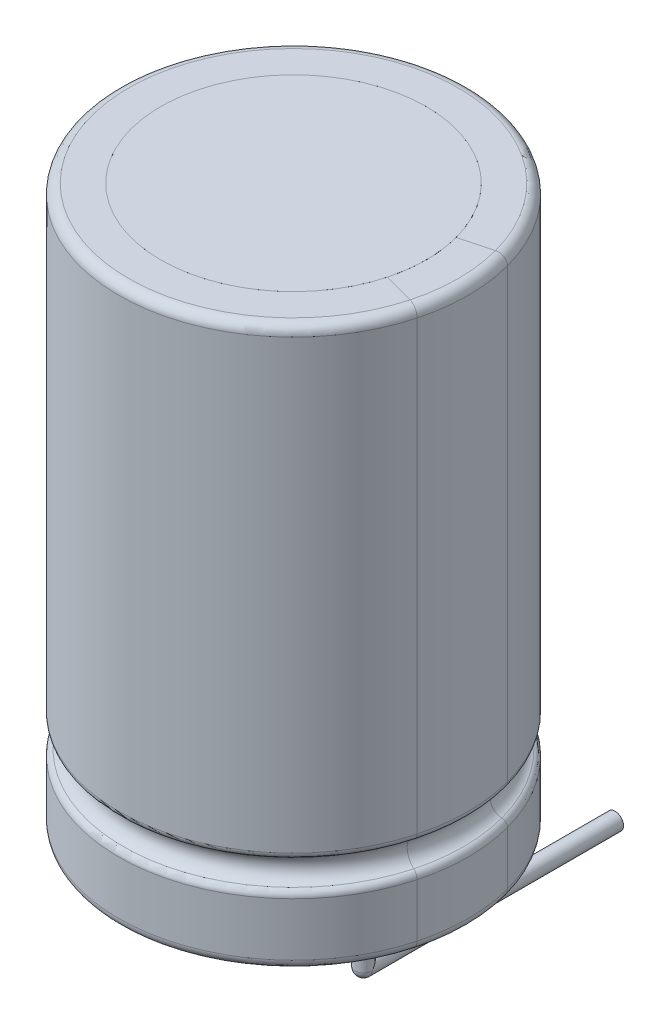
ISO-10303-21;
HEADER;
FILE_DESCRIPTION(('STEP AP214'),'2;1');
FILE_NAME('part.step','',(''),(''),'','','');
FILE_SCHEMA(('AUTOMOTIVE_DESIGN { 1 0 10303 214 1 1 1 1 }'));
ENDSEC;
DATA;
#1=APPLICATION_CONTEXT('core data for automotive mechanical design processes');
#2=APPLICATION_PROTOCOL_DEFINITION('international standard','automotive_design',2000,#1);
#3=PRODUCT_CONTEXT('',#1,'mechanical');
#4=PRODUCT('Part','Part','',(#3));
#5=PRODUCT_RELATED_PRODUCT_CATEGORY('part','',(#4));
#6=PRODUCT_DEFINITION_FORMATION('','',#4);
#7=PRODUCT_DEFINITION_CONTEXT('part definition',#1,'design');
#8=PRODUCT_DEFINITION('design','',#6,#7);
#9=PRODUCT_DEFINITION_SHAPE('','',#8);
#10=(LENGTH_UNIT() NAMED_UNIT(*) SI_UNIT(.MILLI.,.METRE.));
#11=(NAMED_UNIT(*) PLANE_ANGLE_UNIT() SI_UNIT($,.RADIAN.));
#12=(NAMED_UNIT(*) SI_UNIT($,.STERADIAN.) SOLID_ANGLE_UNIT());
#13=UNCERTAINTY_MEASURE_WITH_UNIT(LENGTH_MEASURE(1.E-05),#10,'distance_accuracy_value','');
#14=(GEOMETRIC_REPRESENTATION_CONTEXT(3) GLOBAL_UNCERTAINTY_ASSIGNED_CONTEXT((#13)) GLOBAL_UNIT_ASSIGNED_CONTEXT((#10,
#11,#12)) REPRESENTATION_CONTEXT('',''));
#15=CARTESIAN_POINT('',(0.,0.,0.));
#16=DIRECTION('',(0.,0.,1.));
#17=DIRECTION('',(1.,0.,0.));
#18=AXIS2_PLACEMENT_3D('',#15,#16,#17);
#19=CARTESIAN_POINT('',(2.50410434400621,-3.,0.));
#20=DIRECTION('',(0.,1.,0.));
#21=DIRECTION('',(0.,0.,1.));
#22=AXIS2_PLACEMENT_3D('',#19,#20,#21);
#23=CYLINDRICAL_SURFACE('',#22,0.3);
#24=CARTESIAN_POINT('',(2.50410434400621,-3.,0.));
#25=DIRECTION('',(0.,0.707106781186547,0.707106781186547));
#26=DIRECTION('',(0.,0.707106781186547,-0.707106781186547));
#27=AXIS2_PLACEMENT_3D('',#24,#25,#26);
#28=ELLIPSE('',#27,0.424264068711929,0.3);
#29=CARTESIAN_POINT('',(2.20410434400621,-3.,0.));
#30=VERTEX_POINT('',#29);
#31=CARTESIAN_POINT('',(2.80410434400621,-3.,0.));
#32=VERTEX_POINT('',#31);
#33=EDGE_CURVE('E68',#30,#32,#28,.F.);
#34=ORIENTED_EDGE('',*,*,#33,.F.);
#35=CARTESIAN_POINT('',(2.50410434400621,-3.,0.));
#36=DIRECTION('',(0.,1.,0.));
#37=DIRECTION('',(0.,0.,1.));
#38=AXIS2_PLACEMENT_3D('',#35,#36,#37);
#39=CIRCLE('',#38,0.3);
#40=EDGE_CURVE('E12',#30,#32,#39,.T.);
#41=ORIENTED_EDGE('',*,*,#40,.T.);
#42=EDGE_LOOP('',(#34,#41));
#43=FACE_BOUND('',#42,.T.);
#44=CARTESIAN_POINT('',(2.50410434400621,0.,0.));
#45=DIRECTION('',(0.,1.,0.));
#46=DIRECTION('',(0.,0.,1.));
#47=AXIS2_PLACEMENT_3D('',#44,#45,#46);
#48=CIRCLE('',#47,0.3);
#49=CARTESIAN_POINT('',(2.50410434400621,0.,0.3));
#50=VERTEX_POINT('',#49);
#51=EDGE_CURVE('E53',#50,#50,#48,.T.);
#52=ORIENTED_EDGE('',*,*,#51,.F.);
#53=EDGE_LOOP('',(#52));
#54=FACE_BOUND('',#53,.T.);
#55=ADVANCED_FACE('F50',(#43,#54),#23,.T.);
#56=CARTESIAN_POINT('',(2.50410434400621,0.,0.));
#57=DIRECTION('',(0.,1.,0.));
#58=DIRECTION('',(0.,0.,1.));
#59=AXIS2_PLACEMENT_3D('',#56,#57,#58);
#60=PLANE('',#59);
#61=ORIENTED_EDGE('',*,*,#51,.T.);
#62=EDGE_LOOP('',(#61));
#63=FACE_BOUND('',#62,.T.);
#64=ADVANCED_FACE('F88',(#63),#60,.T.);
#65=CARTESIAN_POINT('',(2.50410434400621,-3.,-9.));
#66=DIRECTION('',(0.,0.,1.));
#67=DIRECTION('',(1.,0.,0.));
#68=AXIS2_PLACEMENT_3D('',#65,#66,#67);
#69=CYLINDRICAL_SURFACE('',#68,0.3);
#70=CARTESIAN_POINT('',(2.50410434400621,-3.,-9.));
#71=DIRECTION('',(0.,0.,1.));
#72=DIRECTION('',(1.,0.,0.));
#73=AXIS2_PLACEMENT_3D('',#70,#71,#72);
#74=CIRCLE('',#73,0.3);
#75=CARTESIAN_POINT('',(2.80410434400621,-3.,-9.));
#76=VERTEX_POINT('',#75);
#77=EDGE_CURVE('E71',#76,#76,#74,.T.);
#78=ORIENTED_EDGE('',*,*,#77,.T.);
#79=EDGE_LOOP('',(#78));
#80=FACE_BOUND('',#79,.T.);
#81=CARTESIAN_POINT('',(2.50410434400621,-3.,0.));
#82=DIRECTION('',(0.,0.,1.));
#83=DIRECTION('',(1.,0.,0.));
#84=AXIS2_PLACEMENT_3D('',#81,#82,#83);
#85=CIRCLE('',#84,0.3);
#86=EDGE_CURVE('E63',#30,#32,#85,.T.);
#87=ORIENTED_EDGE('',*,*,#86,.F.);
#88=ORIENTED_EDGE('',*,*,#33,.T.);
#89=EDGE_LOOP('',(#87,#88));
#90=FACE_BOUND('',#89,.T.);
#91=ADVANCED_FACE('F70',(#80,#90),#69,.T.);
#92=CARTESIAN_POINT('',(2.50410434400621,-3.,-9.));
#93=DIRECTION('',(0.,0.,1.));
#94=DIRECTION('',(1.,0.,0.));
#95=AXIS2_PLACEMENT_3D('',#92,#93,#94);
#96=PLANE('',#95);
#97=ORIENTED_EDGE('',*,*,#77,.F.);
#98=EDGE_LOOP('',(#97));
#99=FACE_BOUND('',#98,.T.);
#100=ADVANCED_FACE('F80',(#99),#96,.F.);
#101=CARTESIAN_POINT('',(2.50410434400621,-3.,0.));
#102=DIRECTION('',(1.,0.,0.));
#103=DIRECTION('',(0.,-1.,0.));
#104=AXIS2_PLACEMENT_3D('',#101,#102,#103);
#105=SPHERICAL_SURFACE('',#104,0.3);
#106=ORIENTED_EDGE('',*,*,#86,.T.);
#107=ORIENTED_EDGE('',*,*,#40,.F.);
#108=EDGE_LOOP('',(#106,#107));
#109=FACE_BOUND('',#108,.T.);
#110=ADVANCED_FACE('F73',(#109),#105,.T.);
#111=CLOSED_SHELL('',(#55,#64,#91,#100,#110));
#112=MANIFOLD_SOLID_BREP('B2',#111);
#113=CARTESIAN_POINT('',(-2.50410434400621,-3.,0.));
#114=DIRECTION('',(0.,1.,0.));
#115=DIRECTION('',(0.,0.,1.));
#116=AXIS2_PLACEMENT_3D('',#113,#114,#115);
#117=CYLINDRICAL_SURFACE('',#116,0.3);
#118=CARTESIAN_POINT('',(-2.50410434400621,-3.,0.));
#119=DIRECTION('',(0.,0.707106781186547,0.707106781186547));
#120=DIRECTION('',(0.,0.707106781186547,-0.707106781186547));
#121=AXIS2_PLACEMENT_3D('',#118,#119,#120);
#122=ELLIPSE('',#121,0.424264068711929,0.3);
#123=CARTESIAN_POINT('',(-2.80410434400621,-3.,0.));
#124=VERTEX_POINT('',#123);
#125=CARTESIAN_POINT('',(-2.20410434400621,-3.,0.));
#126=VERTEX_POINT('',#125);
#127=EDGE_CURVE('E154',#124,#126,#122,.F.);
#128=ORIENTED_EDGE('',*,*,#127,.F.);
#129=CARTESIAN_POINT('',(-2.50410434400621,-3.,0.));
#130=DIRECTION('',(0.,1.,0.));
#131=DIRECTION('',(0.,0.,1.));
#132=AXIS2_PLACEMENT_3D('',#129,#130,#131);
#133=CIRCLE('',#132,0.3);
#134=EDGE_CURVE('E48',#124,#126,#133,.T.);
#135=ORIENTED_EDGE('',*,*,#134,.T.);
#136=EDGE_LOOP('',(#128,#135));
#137=FACE_BOUND('',#136,.T.);
#138=CARTESIAN_POINT('',(-2.50410434400621,0.,0.));
#139=DIRECTION('',(0.,1.,0.));
#140=DIRECTION('',(0.,0.,1.));
#141=AXIS2_PLACEMENT_3D('',#138,#139,#140);
#142=CIRCLE('',#141,0.3);
#143=CARTESIAN_POINT('',(-2.50410434400621,0.,0.3));
#144=VERTEX_POINT('',#143);
#145=EDGE_CURVE('E139',#144,#144,#142,.T.);
#146=ORIENTED_EDGE('',*,*,#145,.F.);
#147=EDGE_LOOP('',(#146));
#148=FACE_BOUND('',#147,.T.);
#149=ADVANCED_FACE('F136',(#137,#148),#117,.T.);
#150=CARTESIAN_POINT('',(-2.50410434400621,0.,0.));
#151=DIRECTION('',(0.,1.,0.));
#152=DIRECTION('',(0.,0.,1.));
#153=AXIS2_PLACEMENT_3D('',#150,#151,#152);
#154=PLANE('',#153);
#155=ORIENTED_EDGE('',*,*,#145,.T.);
#156=EDGE_LOOP('',(#155));
#157=FACE_BOUND('',#156,.T.);
#158=ADVANCED_FACE('F174',(#157),#154,.T.);
#159=CARTESIAN_POINT('',(-2.50410434400621,-3.,-9.));
#160=DIRECTION('',(0.,0.,1.));
#161=DIRECTION('',(1.,0.,0.));
#162=AXIS2_PLACEMENT_3D('',#159,#160,#161);
#163=CYLINDRICAL_SURFACE('',#162,0.3);
#164=CARTESIAN_POINT('',(-2.50410434400621,-3.,-9.));
#165=DIRECTION('',(0.,0.,1.));
#166=DIRECTION('',(1.,0.,0.));
#167=AXIS2_PLACEMENT_3D('',#164,#165,#166);
#168=CIRCLE('',#167,0.3);
#169=CARTESIAN_POINT('',(-2.20410434400621,-3.,-9.));
#170=VERTEX_POINT('',#169);
#171=EDGE_CURVE('E157',#170,#170,#168,.T.);
#172=ORIENTED_EDGE('',*,*,#171,.T.);
#173=EDGE_LOOP('',(#172));
#174=FACE_BOUND('',#173,.T.);
#175=CARTESIAN_POINT('',(-2.50410434400621,-3.,0.));
#176=DIRECTION('',(0.,0.,1.));
#177=DIRECTION('',(1.,0.,0.));
#178=AXIS2_PLACEMENT_3D('',#175,#176,#177);
#179=CIRCLE('',#178,0.3);
#180=EDGE_CURVE('E149',#124,#126,#179,.T.);
#181=ORIENTED_EDGE('',*,*,#180,.F.);
#182=ORIENTED_EDGE('',*,*,#127,.T.);
#183=EDGE_LOOP('',(#181,#182));
#184=FACE_BOUND('',#183,.T.);
#185=ADVANCED_FACE('F156',(#174,#184),#163,.T.);
#186=CARTESIAN_POINT('',(-2.50410434400621,-3.,-9.));
#187=DIRECTION('',(0.,0.,1.));
#188=DIRECTION('',(1.,0.,0.));
#189=AXIS2_PLACEMENT_3D('',#186,#187,#188);
#190=PLANE('',#189);
#191=ORIENTED_EDGE('',*,*,#171,.F.);
#192=EDGE_LOOP('',(#191));
#193=FACE_BOUND('',#192,.T.);
#194=ADVANCED_FACE('F166',(#193),#190,.F.);
#195=CARTESIAN_POINT('',(-2.50410434400621,-3.,0.));
#196=DIRECTION('',(1.,0.,0.));
#197=DIRECTION('',(0.,-1.,0.));
#198=AXIS2_PLACEMENT_3D('',#195,#196,#197);
#199=SPHERICAL_SURFACE('',#198,0.3);
#200=ORIENTED_EDGE('',*,*,#180,.T.);
#201=ORIENTED_EDGE('',*,*,#134,.F.);
#202=EDGE_LOOP('',(#200,#201));
#203=FACE_BOUND('',#202,.T.);
#204=ADVANCED_FACE('F159',(#203),#199,.T.);
#205=CLOSED_SHELL('',(#149,#158,#185,#194,#204));
#206=MANIFOLD_SOLID_BREP('B6',#205);
#207=CARTESIAN_POINT('',(0.,20.,0.));
#208=DIRECTION('',(0.,-1.,0.));
#209=DIRECTION('',(0.,0.,-1.));
#210=AXIS2_PLACEMENT_3D('',#207,#208,#209);
#211=CYLINDRICAL_SURFACE('',#210,6.25);
#212=DIRECTION('',(0.,-1.,0.));
#213=VECTOR('',#212,1.);
#214=CARTESIAN_POINT('',(6.03703641430667,20.,-1.61761903189076));
#215=LINE('',#214,#213);
#216=CARTESIAN_POINT('',(6.03703641430667,2.25336517337282,-1.61761903189076));
#217=VERTEX_POINT('',#216);
#218=CARTESIAN_POINT('',(6.03703641430667,0.35,-1.61761903189076));
#219=VERTEX_POINT('',#218);
#220=EDGE_CURVE('E338',#217,#219,#215,.T.);
#221=ORIENTED_EDGE('',*,*,#220,.F.);
#222=CARTESIAN_POINT('',(0.,2.25336517337282,0.));
#223=DIRECTION('',(0.,-1.,0.));
#224=DIRECTION('',(0.,0.,-1.));
#225=AXIS2_PLACEMENT_3D('',#222,#223,#224);
#226=CIRCLE('',#225,6.25);
#227=CARTESIAN_POINT('',(6.03703641430668,2.25336517337282,1.61761903189076));
#228=VERTEX_POINT('',#227);
#229=EDGE_CURVE('E245',#217,#228,#226,.T.);
#230=ORIENTED_EDGE('',*,*,#229,.T.);
#231=DIRECTION('',(0.,-1.,0.));
#232=VECTOR('',#231,1.);
#233=CARTESIAN_POINT('',(6.03703641430668,20.,1.61761903189076));
#234=LINE('',#233,#232);
#235=CARTESIAN_POINT('',(6.03703641430668,0.35,1.61761903189076));
#236=VERTEX_POINT('',#235);
#237=EDGE_CURVE('E342',#228,#236,#234,.T.);
#238=ORIENTED_EDGE('',*,*,#237,.T.);
#239=CARTESIAN_POINT('',(0.,0.35,0.));
#240=DIRECTION('',(0.,1.,0.));
#241=DIRECTION('',(0.,0.,1.));
#242=AXIS2_PLACEMENT_3D('',#239,#240,#241);
#243=CIRCLE('',#242,6.25);
#244=EDGE_CURVE('E345',#236,#219,#243,.T.);
#245=ORIENTED_EDGE('',*,*,#244,.T.);
#246=EDGE_LOOP('',(#221,#230,#238,#245));
#247=FACE_BOUND('',#246,.T.);
#248=ADVANCED_FACE('F222',(#247),#211,.T.);
#249=CARTESIAN_POINT('',(6.03703641430668,19.65,1.61761903189076));
#250=VERTEX_POINT('',#249);
#251=CARTESIAN_POINT('',(6.03703641430668,3.66757873574592,1.61761903189076));
#252=VERTEX_POINT('',#251);
#253=EDGE_CURVE('E311',#250,#252,#234,.T.);
#254=ORIENTED_EDGE('',*,*,#253,.T.);
#255=CARTESIAN_POINT('',(0.,3.66757873574592,0.));
#256=DIRECTION('',(0.,1.,0.));
#257=DIRECTION('',(0.,0.,1.));
#258=AXIS2_PLACEMENT_3D('',#255,#256,#257);
#259=CIRCLE('',#258,6.25);
#260=CARTESIAN_POINT('',(6.03703641430667,3.66757873574592,-1.61761903189076));
#261=VERTEX_POINT('',#260);
#262=EDGE_CURVE('E134',#252,#261,#259,.T.);
#263=ORIENTED_EDGE('',*,*,#262,.T.);
#264=CARTESIAN_POINT('',(6.03703641430667,19.65,-1.61761903189076));
#265=VERTEX_POINT('',#264);
#266=EDGE_CURVE('E339',#265,#261,#215,.T.);
#267=ORIENTED_EDGE('',*,*,#266,.F.);
#268=CARTESIAN_POINT('',(0.,19.65,0.));
#269=DIRECTION('',(0.,1.,0.));
#270=DIRECTION('',(0.,0.,1.));
#271=AXIS2_PLACEMENT_3D('',#268,#269,#270);
#272=CIRCLE('',#271,6.25);
#273=EDGE_CURVE('E310',#265,#250,#272,.F.);
#274=ORIENTED_EDGE('',*,*,#273,.T.);
#275=EDGE_LOOP('',(#254,#263,#267,#274));
#276=FACE_BOUND('',#275,.T.);
#277=ADVANCED_FACE('F405',(#276),#211,.T.);
#278=CARTESIAN_POINT('',(0.,20.,0.));
#279=DIRECTION('',(0.,-1.,0.));
#280=DIRECTION('',(0.,0.,-1.));
#281=AXIS2_PLACEMENT_3D('',#278,#279,#280);
#282=CYLINDRICAL_SURFACE('',#281,4.75);
#283=CARTESIAN_POINT('',(0.,0.,0.));
#284=DIRECTION('',(0.,1.,0.));
#285=DIRECTION('',(0.,0.,1.));
#286=AXIS2_PLACEMENT_3D('',#283,#284,#285);
#287=CIRCLE('',#286,4.75);
#288=CARTESIAN_POINT('',(4.58814767487307,0.,1.22939046423698));
#289=VERTEX_POINT('',#288);
#290=CARTESIAN_POINT('',(4.58814767487307,0.,-1.22939046423698));
#291=VERTEX_POINT('',#290);
#292=EDGE_CURVE('E307',#289,#291,#287,.T.);
#293=ORIENTED_EDGE('',*,*,#292,.F.);
#294=DIRECTION('',(0.,-1.,0.));
#295=VECTOR('',#294,1.);
#296=CARTESIAN_POINT('',(4.58814767487307,20.,1.22939046423698));
#297=LINE('',#296,#295);
#298=CARTESIAN_POINT('',(4.58814767487307,20.,1.22939046423698));
#299=VERTEX_POINT('',#298);
#300=EDGE_CURVE('E300',#299,#289,#297,.T.);
#301=ORIENTED_EDGE('',*,*,#300,.F.);
#302=CARTESIAN_POINT('',(0.,20.,0.));
#303=DIRECTION('',(0.,1.,0.));
#304=DIRECTION('',(0.,0.,1.));
#305=AXIS2_PLACEMENT_3D('',#302,#303,#304);
#306=CIRCLE('',#305,4.75);
#307=CARTESIAN_POINT('',(4.58814767487307,20.,-1.22939046423698));
#308=VERTEX_POINT('',#307);
#309=EDGE_CURVE('E304',#299,#308,#306,.T.);
#310=ORIENTED_EDGE('',*,*,#309,.T.);
#311=DIRECTION('',(0.,-1.,0.));
#312=VECTOR('',#311,1.);
#313=CARTESIAN_POINT('',(4.58814767487307,20.,-1.22939046423698));
#314=LINE('',#313,#312);
#315=EDGE_CURVE('E334',#308,#291,#314,.T.);
#316=ORIENTED_EDGE('',*,*,#315,.T.);
#317=EDGE_LOOP('',(#293,#301,#310,#316));
#318=FACE_BOUND('',#317,.T.);
#319=ADVANCED_FACE('F302',(#318),#282,.F.);
#320=CARTESIAN_POINT('',(0.,20.,0.));
#321=DIRECTION('',(0.258819045102521,0.,-0.965925826289068));
#322=DIRECTION('',(-0.965925826289068,0.,-0.258819045102521));
#323=AXIS2_PLACEMENT_3D('',#320,#321,#322);
#324=PLANE('',#323);
#325=ORIENTED_EDGE('',*,*,#237,.F.);
#326=CARTESIAN_POINT('',(5.79555495773441,2.25336517337282,1.55291427061513));
#327=DIRECTION('',(0.258819045102521,0.,-0.965925826289068));
#328=DIRECTION('',(-0.965925826289068,0.,-0.258819045102521));
#329=AXIS2_PLACEMENT_3D('',#326,#327,#328);
#330=CIRCLE('',#329,0.25);
#331=CARTESIAN_POINT('',(5.87604877659183,2.48906743376834,1.57448252437367));
#332=VERTEX_POINT('',#331);
#333=EDGE_CURVE('E230',#228,#332,#330,.F.);
#334=ORIENTED_EDGE('',*,*,#333,.T.);
#335=CARTESIAN_POINT('',(6.03703641430668,2.96047195455937,1.61761903189076));
#336=DIRECTION('',(0.258819045102521,0.,-0.965925826289068));
#337=DIRECTION('',(-0.965925826289068,0.,-0.258819045102521));
#338=AXIS2_PLACEMENT_3D('',#335,#336,#337);
#339=CIRCLE('',#338,0.500000000000001);
#340=CARTESIAN_POINT('',(5.87604877659183,3.4318764753504,1.57448252437367));
#341=VERTEX_POINT('',#340);
#342=EDGE_CURVE('E331',#341,#332,#339,.F.);
#343=ORIENTED_EDGE('',*,*,#342,.F.);
#344=CARTESIAN_POINT('',(5.79555495773441,3.66757873574592,1.55291427061513));
#345=DIRECTION('',(0.258819045102521,0.,-0.965925826289068));
#346=DIRECTION('',(-0.965925826289068,0.,-0.258819045102521));
#347=AXIS2_PLACEMENT_3D('',#344,#345,#346);
#348=CIRCLE('',#347,0.25);
#349=EDGE_CURVE('E237',#341,#252,#348,.F.);
#350=ORIENTED_EDGE('',*,*,#349,.T.);
#351=ORIENTED_EDGE('',*,*,#253,.F.);
#352=CARTESIAN_POINT('',(5.6989623751055,19.65,1.52703236610488));
#353=DIRECTION('',(0.258819045102521,0.,-0.965925826289068));
#354=DIRECTION('',(-0.965925826289068,0.,-0.258819045102521));
#355=AXIS2_PLACEMENT_3D('',#352,#353,#354);
#356=CIRCLE('',#355,0.35);
#357=CARTESIAN_POINT('',(5.6989623751055,20.,1.52703236610488));
#358=VERTEX_POINT('',#357);
#359=EDGE_CURVE('E317',#250,#358,#356,.F.);
#360=ORIENTED_EDGE('',*,*,#359,.T.);
#361=DIRECTION('',(0.965925826289068,0.,0.258819045102521));
#362=VECTOR('',#361,1.);
#363=CARTESIAN_POINT('',(0.,20.,0.));
#364=LINE('',#363,#362);
#365=EDGE_CURVE('E314',#299,#358,#364,.T.);
#366=ORIENTED_EDGE('',*,*,#365,.F.);
#367=ORIENTED_EDGE('',*,*,#300,.T.);
#368=DIRECTION('',(0.965925826289068,0.,0.258819045102521));
#369=VECTOR('',#368,1.);
#370=CARTESIAN_POINT('',(0.,0.,0.));
#371=LINE('',#370,#369);
#372=CARTESIAN_POINT('',(5.6989623751055,0.,1.52703236610488));
#373=VERTEX_POINT('',#372);
#374=EDGE_CURVE('E328',#289,#373,#371,.T.);
#375=ORIENTED_EDGE('',*,*,#374,.T.);
#376=CARTESIAN_POINT('',(5.6989623751055,0.35,1.52703236610488));
#377=DIRECTION('',(0.258819045102521,0.,-0.965925826289068));
#378=DIRECTION('',(-0.965925826289068,0.,-0.258819045102521));
#379=AXIS2_PLACEMENT_3D('',#376,#377,#378);
#380=CIRCLE('',#379,0.35);
#381=EDGE_CURVE('E355',#373,#236,#380,.F.);
#382=ORIENTED_EDGE('',*,*,#381,.T.);
#383=EDGE_LOOP('',(#325,#334,#343,#350,#351,#360,#366,#367,#375,#382));
#384=FACE_BOUND('',#383,.T.);
#385=ADVANCED_FACE('F315',(#384),#324,.F.);
#386=CARTESIAN_POINT('',(0.,20.,0.));
#387=DIRECTION('',(-0.258819045102522,0.,-0.965925826289068));
#388=DIRECTION('',(-0.965925826289068,0.,0.258819045102522));
#389=AXIS2_PLACEMENT_3D('',#386,#387,#388);
#390=PLANE('',#389);
#391=CARTESIAN_POINT('',(6.03703641430668,2.96047195455937,-1.61761903189076));
#392=DIRECTION('',(-0.258819045102522,0.,-0.965925826289068));
#393=DIRECTION('',(-0.965925826289068,0.,0.258819045102522));
#394=AXIS2_PLACEMENT_3D('',#391,#392,#393);
#395=CIRCLE('',#394,0.500000000000001);
#396=CARTESIAN_POINT('',(5.87604877659183,3.4318764753504,-1.57448252437367));
#397=VERTEX_POINT('',#396);
#398=CARTESIAN_POINT('',(5.87604877659183,2.48906743376834,-1.57448252437367));
#399=VERTEX_POINT('',#398);
#400=EDGE_CURVE('E360',#397,#399,#395,.F.);
#401=ORIENTED_EDGE('',*,*,#400,.T.);
#402=CARTESIAN_POINT('',(5.79555495773441,2.25336517337282,-1.55291427061513));
#403=DIRECTION('',(-0.258819045102522,0.,-0.965925826289068));
#404=DIRECTION('',(-0.965925826289068,0.,0.258819045102522));
#405=AXIS2_PLACEMENT_3D('',#402,#403,#404);
#406=CIRCLE('',#405,0.25);
#407=EDGE_CURVE('E371',#399,#217,#406,.T.);
#408=ORIENTED_EDGE('',*,*,#407,.T.);
#409=ORIENTED_EDGE('',*,*,#220,.T.);
#410=CARTESIAN_POINT('',(5.6989623751055,0.35,-1.52703236610488));
#411=DIRECTION('',(-0.258819045102522,0.,-0.965925826289068));
#412=DIRECTION('',(-0.965925826289068,0.,0.258819045102522));
#413=AXIS2_PLACEMENT_3D('',#410,#411,#412);
#414=CIRCLE('',#413,0.35);
#415=CARTESIAN_POINT('',(5.6989623751055,0.,-1.52703236610488));
#416=VERTEX_POINT('',#415);
#417=EDGE_CURVE('E350',#219,#416,#414,.T.);
#418=ORIENTED_EDGE('',*,*,#417,.T.);
#419=DIRECTION('',(0.965925826289068,0.,-0.258819045102522));
#420=VECTOR('',#419,1.);
#421=CARTESIAN_POINT('',(0.,0.,0.));
#422=LINE('',#421,#420);
#423=EDGE_CURVE('E325',#291,#416,#422,.T.);
#424=ORIENTED_EDGE('',*,*,#423,.F.);
#425=ORIENTED_EDGE('',*,*,#315,.F.);
#426=DIRECTION('',(0.965925826289068,0.,-0.258819045102522));
#427=VECTOR('',#426,1.);
#428=CARTESIAN_POINT('',(0.,20.,0.));
#429=LINE('',#428,#427);
#430=CARTESIAN_POINT('',(5.6989623751055,20.,-1.52703236610488));
#431=VERTEX_POINT('',#430);
#432=EDGE_CURVE('E321',#308,#431,#429,.T.);
#433=ORIENTED_EDGE('',*,*,#432,.T.);
#434=CARTESIAN_POINT('',(5.6989623751055,19.65,-1.52703236610488));
#435=DIRECTION('',(-0.258819045102522,0.,-0.965925826289068));
#436=DIRECTION('',(-0.965925826289068,0.,0.258819045102522));
#437=AXIS2_PLACEMENT_3D('',#434,#435,#436);
#438=CIRCLE('',#437,0.35);
#439=EDGE_CURVE('E348',#431,#265,#438,.T.);
#440=ORIENTED_EDGE('',*,*,#439,.T.);
#441=ORIENTED_EDGE('',*,*,#266,.T.);
#442=CARTESIAN_POINT('',(5.79555495773441,3.66757873574592,-1.55291427061513));
#443=DIRECTION('',(-0.258819045102522,0.,-0.965925826289068));
#444=DIRECTION('',(-0.965925826289068,0.,0.258819045102522));
#445=AXIS2_PLACEMENT_3D('',#442,#443,#444);
#446=CIRCLE('',#445,0.25);
#447=EDGE_CURVE('E369',#261,#397,#446,.T.);
#448=ORIENTED_EDGE('',*,*,#447,.T.);
#449=EDGE_LOOP('',(#401,#408,#409,#418,#424,#425,#433,#440,#441,#448));
#450=FACE_BOUND('',#449,.T.);
#451=ADVANCED_FACE('F384',(#450),#390,.T.);
#452=CARTESIAN_POINT('',(0.,20.,0.));
#453=DIRECTION('',(0.,1.,0.));
#454=DIRECTION('',(0.,0.,1.));
#455=AXIS2_PLACEMENT_3D('',#452,#453,#454);
#456=PLANE('',#455);
#457=ORIENTED_EDGE('',*,*,#365,.T.);
#458=CARTESIAN_POINT('',(0.,20.,0.));
#459=DIRECTION('',(0.,1.,0.));
#460=DIRECTION('',(0.,0.,1.));
#461=AXIS2_PLACEMENT_3D('',#458,#459,#460);
#462=CIRCLE('',#461,5.9);
#463=EDGE_CURVE('E358',#358,#431,#462,.T.);
#464=ORIENTED_EDGE('',*,*,#463,.T.);
#465=ORIENTED_EDGE('',*,*,#432,.F.);
#466=ORIENTED_EDGE('',*,*,#309,.F.);
#467=EDGE_LOOP('',(#457,#464,#465,#466));
#468=FACE_BOUND('',#467,.T.);
#469=ADVANCED_FACE('F323',(#468),#456,.T.);
#470=CARTESIAN_POINT('',(0.,0.,0.));
#471=DIRECTION('',(0.,1.,0.));
#472=DIRECTION('',(0.,0.,1.));
#473=AXIS2_PLACEMENT_3D('',#470,#471,#472);
#474=PLANE('',#473);
#475=ORIENTED_EDGE('',*,*,#423,.T.);
#476=CARTESIAN_POINT('',(0.,0.,0.));
#477=DIRECTION('',(0.,1.,0.));
#478=DIRECTION('',(0.,0.,1.));
#479=AXIS2_PLACEMENT_3D('',#476,#477,#478);
#480=CIRCLE('',#479,5.9);
#481=EDGE_CURVE('E352',#416,#373,#480,.F.);
#482=ORIENTED_EDGE('',*,*,#481,.T.);
#483=ORIENTED_EDGE('',*,*,#374,.F.);
#484=ORIENTED_EDGE('',*,*,#292,.T.);
#485=EDGE_LOOP('',(#475,#482,#483,#484));
#486=FACE_BOUND('',#485,.T.);
#487=ADVANCED_FACE('F393',(#486),#474,.F.);
#488=CARTESIAN_POINT('',(0.,0.35,0.));
#489=DIRECTION('',(0.,1.,0.));
#490=DIRECTION('',(0.,0.,1.));
#491=AXIS2_PLACEMENT_3D('',#488,#489,#490);
#492=TOROIDAL_SURFACE('',#491,5.9,0.35);
#493=ORIENTED_EDGE('',*,*,#381,.F.);
#494=ORIENTED_EDGE('',*,*,#481,.F.);
#495=ORIENTED_EDGE('',*,*,#417,.F.);
#496=ORIENTED_EDGE('',*,*,#244,.F.);
#497=EDGE_LOOP('',(#493,#494,#495,#496));
#498=FACE_BOUND('',#497,.T.);
#499=ADVANCED_FACE('F389',(#498),#492,.T.);
#500=CARTESIAN_POINT('',(0.,19.65,0.));
#501=DIRECTION('',(0.,1.,0.));
#502=DIRECTION('',(0.,0.,1.));
#503=AXIS2_PLACEMENT_3D('',#500,#501,#502);
#504=TOROIDAL_SURFACE('',#503,5.9,0.35);
#505=ORIENTED_EDGE('',*,*,#359,.F.);
#506=ORIENTED_EDGE('',*,*,#273,.F.);
#507=ORIENTED_EDGE('',*,*,#439,.F.);
#508=ORIENTED_EDGE('',*,*,#463,.F.);
#509=EDGE_LOOP('',(#505,#506,#507,#508));
#510=FACE_BOUND('',#509,.T.);
#511=ADVANCED_FACE('F400',(#510),#504,.T.);
#512=CARTESIAN_POINT('',(0.,2.96047195455937,0.));
#513=DIRECTION('',(0.,-1.,0.));
#514=DIRECTION('',(0.,0.,-1.));
#515=AXIS2_PLACEMENT_3D('',#512,#513,#514);
#516=TOROIDAL_SURFACE('',#515,6.25,0.500000000000001);
#517=ORIENTED_EDGE('',*,*,#342,.T.);
#518=CARTESIAN_POINT('',(0.,2.48906743376847,0.));
#519=DIRECTION('',(0.,1.,0.));
#520=DIRECTION('',(0.,0.,1.));
#521=AXIS2_PLACEMENT_3D('',#518,#519,#520);
#522=CIRCLE('',#521,6.08333333333338);
#523=EDGE_CURVE('E366',#332,#399,#522,.T.);
#524=ORIENTED_EDGE('',*,*,#523,.T.);
#525=ORIENTED_EDGE('',*,*,#400,.F.);
#526=CARTESIAN_POINT('',(0.,3.43187647535033,0.));
#527=DIRECTION('',(0.,-1.,0.));
#528=DIRECTION('',(0.,0.,-1.));
#529=AXIS2_PLACEMENT_3D('',#526,#527,#528);
#530=CIRCLE('',#529,6.08333333333336);
#531=EDGE_CURVE('E363',#397,#341,#530,.T.);
#532=ORIENTED_EDGE('',*,*,#531,.T.);
#533=EDGE_LOOP('',(#517,#524,#525,#532));
#534=FACE_BOUND('',#533,.T.);
#535=ADVANCED_FACE('F379',(#534),#516,.F.);
#536=CARTESIAN_POINT('',(0.,2.25336517337282,0.));
#537=DIRECTION('',(0.,-1.,0.));
#538=DIRECTION('',(0.,0.,-1.));
#539=AXIS2_PLACEMENT_3D('',#536,#537,#538);
#540=TOROIDAL_SURFACE('',#539,6.,0.25);
#541=ORIENTED_EDGE('',*,*,#333,.F.);
#542=ORIENTED_EDGE('',*,*,#229,.F.);
#543=ORIENTED_EDGE('',*,*,#407,.F.);
#544=ORIENTED_EDGE('',*,*,#523,.F.);
#545=EDGE_LOOP('',(#541,#542,#543,#544));
#546=FACE_BOUND('',#545,.T.);
#547=ADVANCED_FACE('F382',(#546),#540,.T.);
#548=CARTESIAN_POINT('',(0.,3.66757873574592,0.));
#549=DIRECTION('',(0.,1.,0.));
#550=DIRECTION('',(0.,0.,1.));
#551=AXIS2_PLACEMENT_3D('',#548,#549,#550);
#552=TOROIDAL_SURFACE('',#551,6.,0.25);
#553=ORIENTED_EDGE('',*,*,#447,.F.);
#554=ORIENTED_EDGE('',*,*,#262,.F.);
#555=ORIENTED_EDGE('',*,*,#349,.F.);
#556=ORIENTED_EDGE('',*,*,#531,.F.);
#557=EDGE_LOOP('',(#553,#554,#555,#556));
#558=FACE_BOUND('',#557,.T.);
#559=ADVANCED_FACE('F224',(#558),#552,.T.);
#560=CLOSED_SHELL('',(#248,#277,#319,#385,#451,#469,#487,#499,#511,#535,#547,#559));
#561=MANIFOLD_SOLID_BREP('B42',#560);
#562=CARTESIAN_POINT('',(0.,20.,0.));
#563=DIRECTION('',(0.,-1.,0.));
#564=DIRECTION('',(0.,0.,-1.));
#565=AXIS2_PLACEMENT_3D('',#562,#563,#564);
#566=CYLINDRICAL_SURFACE('',#565,6.25);
#567=DIRECTION('',(0.,-1.,0.));
#568=VECTOR('',#567,1.);
#569=CARTESIAN_POINT('',(6.03703641430668,20.,1.61761903189076));
#570=LINE('',#569,#568);
#571=CARTESIAN_POINT('',(6.03703641430668,2.25336517337282,1.61761903189076));
#572=VERTEX_POINT('',#571);
#573=CARTESIAN_POINT('',(6.03703641430668,0.35,1.61761903189076));
#574=VERTEX_POINT('',#573);
#575=EDGE_CURVE('E622',#572,#574,#570,.T.);
#576=ORIENTED_EDGE('',*,*,#575,.F.);
#577=CARTESIAN_POINT('',(0.,2.25336517337282,0.));
#578=DIRECTION('',(0.,-1.,0.));
#579=DIRECTION('',(0.,0.,-1.));
#580=AXIS2_PLACEMENT_3D('',#577,#578,#579);
#581=CIRCLE('',#580,6.25);
#582=CARTESIAN_POINT('',(6.03703641430667,2.25336517337282,-1.61761903189076));
#583=VERTEX_POINT('',#582);
#584=EDGE_CURVE('E529',#572,#583,#581,.T.);
#585=ORIENTED_EDGE('',*,*,#584,.T.);
#586=DIRECTION('',(0.,-1.,0.));
#587=VECTOR('',#586,1.);
#588=CARTESIAN_POINT('',(6.03703641430667,20.,-1.61761903189076));
#589=LINE('',#588,#587);
#590=CARTESIAN_POINT('',(6.03703641430667,0.35,-1.61761903189076));
#591=VERTEX_POINT('',#590);
#592=EDGE_CURVE('E626',#583,#591,#589,.T.);
#593=ORIENTED_EDGE('',*,*,#592,.T.);
#594=CARTESIAN_POINT('',(0.,0.35,0.));
#595=DIRECTION('',(0.,1.,0.));
#596=DIRECTION('',(0.,0.,1.));
#597=AXIS2_PLACEMENT_3D('',#594,#595,#596);
#598=CIRCLE('',#597,6.25);
#599=EDGE_CURVE('E634',#591,#574,#598,.T.);
#600=ORIENTED_EDGE('',*,*,#599,.T.);
#601=EDGE_LOOP('',(#576,#585,#593,#600));
#602=FACE_BOUND('',#601,.T.);
#603=ADVANCED_FACE('F506',(#602),#566,.T.);
#604=CARTESIAN_POINT('',(6.03703641430667,19.65,-1.61761903189076));
#605=VERTEX_POINT('',#604);
#606=CARTESIAN_POINT('',(6.03703641430667,3.66757873574592,-1.61761903189076));
#607=VERTEX_POINT('',#606);
#608=EDGE_CURVE('E595',#605,#607,#589,.T.);
#609=ORIENTED_EDGE('',*,*,#608,.T.);
#610=CARTESIAN_POINT('',(0.,3.66757873574592,0.));
#611=DIRECTION('',(0.,1.,0.));
#612=DIRECTION('',(0.,0.,1.));
#613=AXIS2_PLACEMENT_3D('',#610,#611,#612);
#614=CIRCLE('',#613,6.25);
#615=CARTESIAN_POINT('',(6.03703641430668,3.66757873574592,1.61761903189076));
#616=VERTEX_POINT('',#615);
#617=EDGE_CURVE('E220',#607,#616,#614,.T.);
#618=ORIENTED_EDGE('',*,*,#617,.T.);
#619=CARTESIAN_POINT('',(6.03703641430668,19.65,1.61761903189076));
#620=VERTEX_POINT('',#619);
#621=EDGE_CURVE('E623',#620,#616,#570,.T.);
#622=ORIENTED_EDGE('',*,*,#621,.F.);
#623=CARTESIAN_POINT('',(0.,19.65,0.));
#624=DIRECTION('',(0.,1.,0.));
#625=DIRECTION('',(0.,0.,1.));
#626=AXIS2_PLACEMENT_3D('',#623,#624,#625);
#627=CIRCLE('',#626,6.25);
#628=EDGE_CURVE('E631',#620,#605,#627,.F.);
#629=ORIENTED_EDGE('',*,*,#628,.T.);
#630=EDGE_LOOP('',(#609,#618,#622,#629));
#631=FACE_BOUND('',#630,.T.);
#632=ADVANCED_FACE('F690',(#631),#566,.T.);
#633=CARTESIAN_POINT('',(0.,20.,0.));
#634=DIRECTION('',(0.,-1.,0.));
#635=DIRECTION('',(0.,0.,-1.));
#636=AXIS2_PLACEMENT_3D('',#633,#634,#635);
#637=CYLINDRICAL_SURFACE('',#636,4.75);
#638=CARTESIAN_POINT('',(0.,0.,0.));
#639=DIRECTION('',(0.,1.,0.));
#640=DIRECTION('',(0.,0.,1.));
#641=AXIS2_PLACEMENT_3D('',#638,#639,#640);
#642=CIRCLE('',#641,4.75);
#643=CARTESIAN_POINT('',(4.58814767487307,0.,-1.22939046423698));
#644=VERTEX_POINT('',#643);
#645=CARTESIAN_POINT('',(4.58814767487307,0.,1.22939046423698));
#646=VERTEX_POINT('',#645);
#647=EDGE_CURVE('E591',#644,#646,#642,.T.);
#648=ORIENTED_EDGE('',*,*,#647,.F.);
#649=DIRECTION('',(0.,-1.,0.));
#650=VECTOR('',#649,1.);
#651=CARTESIAN_POINT('',(4.58814767487307,20.,-1.22939046423698));
#652=LINE('',#651,#650);
#653=CARTESIAN_POINT('',(4.58814767487307,20.,-1.22939046423698));
#654=VERTEX_POINT('',#653);
#655=EDGE_CURVE('E584',#654,#644,#652,.T.);
#656=ORIENTED_EDGE('',*,*,#655,.F.);
#657=CARTESIAN_POINT('',(0.,20.,0.));
#658=DIRECTION('',(0.,1.,0.));
#659=DIRECTION('',(0.,0.,1.));
#660=AXIS2_PLACEMENT_3D('',#657,#658,#659);
#661=CIRCLE('',#660,4.75);
#662=CARTESIAN_POINT('',(4.58814767487307,20.,1.22939046423698));
#663=VERTEX_POINT('',#662);
#664=EDGE_CURVE('E588',#654,#663,#661,.T.);
#665=ORIENTED_EDGE('',*,*,#664,.T.);
#666=DIRECTION('',(0.,-1.,0.));
#667=VECTOR('',#666,1.);
#668=CARTESIAN_POINT('',(4.58814767487307,20.,1.22939046423698));
#669=LINE('',#668,#667);
#670=EDGE_CURVE('E618',#663,#646,#669,.T.);
#671=ORIENTED_EDGE('',*,*,#670,.T.);
#672=EDGE_LOOP('',(#648,#656,#665,#671));
#673=FACE_BOUND('',#672,.T.);
#674=ADVANCED_FACE('F586',(#673),#637,.F.);
#675=CARTESIAN_POINT('',(0.,20.,0.));
#676=DIRECTION('',(-0.258819045102522,0.,-0.965925826289068));
#677=DIRECTION('',(-0.965925826289068,0.,0.258819045102522));
#678=AXIS2_PLACEMENT_3D('',#675,#676,#677);
#679=PLANE('',#678);
#680=ORIENTED_EDGE('',*,*,#592,.F.);
#681=CARTESIAN_POINT('',(5.79555495773441,2.25336517337282,-1.55291427061513));
#682=DIRECTION('',(-0.258819045102522,0.,-0.965925826289068));
#683=DIRECTION('',(-0.965925826289068,0.,0.258819045102522));
#684=AXIS2_PLACEMENT_3D('',#681,#682,#683);
#685=CIRCLE('',#684,0.25);
#686=CARTESIAN_POINT('',(5.87604877659183,2.48906743376834,-1.57448252437367));
#687=VERTEX_POINT('',#686);
#688=EDGE_CURVE('E514',#583,#687,#685,.F.);
#689=ORIENTED_EDGE('',*,*,#688,.T.);
#690=CARTESIAN_POINT('',(6.03703641430668,2.96047195455937,-1.61761903189076));
#691=DIRECTION('',(-0.258819045102522,0.,-0.965925826289068));
#692=DIRECTION('',(-0.965925826289068,0.,0.258819045102522));
#693=AXIS2_PLACEMENT_3D('',#690,#691,#692);
#694=CIRCLE('',#693,0.500000000000001);
#695=CARTESIAN_POINT('',(5.87604877659183,3.4318764753504,-1.57448252437367));
#696=VERTEX_POINT('',#695);
#697=EDGE_CURVE('E615',#696,#687,#694,.F.);
#698=ORIENTED_EDGE('',*,*,#697,.F.);
#699=CARTESIAN_POINT('',(5.79555495773441,3.66757873574592,-1.55291427061513));
#700=DIRECTION('',(-0.258819045102522,0.,-0.965925826289068));
#701=DIRECTION('',(-0.965925826289068,0.,0.258819045102522));
#702=AXIS2_PLACEMENT_3D('',#699,#700,#701);
#703=CIRCLE('',#702,0.25);
#704=EDGE_CURVE('E521',#696,#607,#703,.F.);
#705=ORIENTED_EDGE('',*,*,#704,.T.);
#706=ORIENTED_EDGE('',*,*,#608,.F.);
#707=CARTESIAN_POINT('',(5.6989623751055,19.65,-1.52703236610488));
#708=DIRECTION('',(-0.258819045102522,0.,-0.965925826289068));
#709=DIRECTION('',(-0.965925826289068,0.,0.258819045102522));
#710=AXIS2_PLACEMENT_3D('',#707,#708,#709);
#711=CIRCLE('',#710,0.35);
#712=CARTESIAN_POINT('',(5.6989623751055,20.,-1.52703236610488));
#713=VERTEX_POINT('',#712);
#714=EDGE_CURVE('E601',#605,#713,#711,.F.);
#715=ORIENTED_EDGE('',*,*,#714,.T.);
#716=DIRECTION('',(0.965925826289068,0.,-0.258819045102522));
#717=VECTOR('',#716,1.);
#718=CARTESIAN_POINT('',(0.,20.,0.));
#719=LINE('',#718,#717);
#720=EDGE_CURVE('E598',#654,#713,#719,.T.);
#721=ORIENTED_EDGE('',*,*,#720,.F.);
#722=ORIENTED_EDGE('',*,*,#655,.T.);
#723=DIRECTION('',(0.965925826289068,0.,-0.258819045102522));
#724=VECTOR('',#723,1.);
#725=CARTESIAN_POINT('',(0.,0.,0.));
#726=LINE('',#725,#724);
#727=CARTESIAN_POINT('',(5.6989623751055,0.,-1.52703236610488));
#728=VERTEX_POINT('',#727);
#729=EDGE_CURVE('E612',#644,#728,#726,.T.);
#730=ORIENTED_EDGE('',*,*,#729,.T.);
#731=CARTESIAN_POINT('',(5.6989623751055,0.35,-1.52703236610488));
#732=DIRECTION('',(-0.258819045102522,0.,-0.965925826289068));
#733=DIRECTION('',(-0.965925826289068,0.,0.258819045102522));
#734=AXIS2_PLACEMENT_3D('',#731,#732,#733);
#735=CIRCLE('',#734,0.35);
#736=EDGE_CURVE('E641',#728,#591,#735,.F.);
#737=ORIENTED_EDGE('',*,*,#736,.T.);
#738=EDGE_LOOP('',(#680,#689,#698,#705,#706,#715,#721,#722,#730,#737));
#739=FACE_BOUND('',#738,.T.);
#740=ADVANCED_FACE('F599',(#739),#679,.F.);
#741=CARTESIAN_POINT('',(0.,20.,0.));
#742=DIRECTION('',(0.258819045102521,0.,-0.965925826289068));
#743=DIRECTION('',(-0.965925826289068,0.,-0.258819045102521));
#744=AXIS2_PLACEMENT_3D('',#741,#742,#743);
#745=PLANE('',#744);
#746=CARTESIAN_POINT('',(6.03703641430668,2.96047195455937,1.61761903189076));
#747=DIRECTION('',(0.258819045102521,0.,-0.965925826289068));
#748=DIRECTION('',(-0.965925826289068,0.,-0.258819045102521));
#749=AXIS2_PLACEMENT_3D('',#746,#747,#748);
#750=CIRCLE('',#749,0.500000000000001);
#751=CARTESIAN_POINT('',(5.87604877659183,3.4318764753504,1.57448252437367));
#752=VERTEX_POINT('',#751);
#753=CARTESIAN_POINT('',(5.87604877659183,2.48906743376834,1.57448252437367));
#754=VERTEX_POINT('',#753);
#755=EDGE_CURVE('E644',#752,#754,#750,.F.);
#756=ORIENTED_EDGE('',*,*,#755,.T.);
#757=CARTESIAN_POINT('',(5.79555495773441,2.25336517337282,1.55291427061513));
#758=DIRECTION('',(0.258819045102521,0.,-0.965925826289068));
#759=DIRECTION('',(-0.965925826289068,0.,-0.258819045102521));
#760=AXIS2_PLACEMENT_3D('',#757,#758,#759);
#761=CIRCLE('',#760,0.25);
#762=EDGE_CURVE('E655',#754,#572,#761,.T.);
#763=ORIENTED_EDGE('',*,*,#762,.T.);
#764=ORIENTED_EDGE('',*,*,#575,.T.);
#765=CARTESIAN_POINT('',(5.6989623751055,0.35,1.52703236610488));
#766=DIRECTION('',(0.258819045102521,0.,-0.965925826289068));
#767=DIRECTION('',(-0.965925826289068,0.,-0.258819045102521));
#768=AXIS2_PLACEMENT_3D('',#765,#766,#767);
#769=CIRCLE('',#768,0.35);
#770=CARTESIAN_POINT('',(5.6989623751055,0.,1.52703236610488));
#771=VERTEX_POINT('',#770);
#772=EDGE_CURVE('E637',#574,#771,#769,.T.);
#773=ORIENTED_EDGE('',*,*,#772,.T.);
#774=DIRECTION('',(0.965925826289068,0.,0.258819045102521));
#775=VECTOR('',#774,1.);
#776=CARTESIAN_POINT('',(0.,0.,0.));
#777=LINE('',#776,#775);
#778=EDGE_CURVE('E609',#646,#771,#777,.T.);
#779=ORIENTED_EDGE('',*,*,#778,.F.);
#780=ORIENTED_EDGE('',*,*,#670,.F.);
#781=DIRECTION('',(0.965925826289068,0.,0.258819045102521));
#782=VECTOR('',#781,1.);
#783=CARTESIAN_POINT('',(0.,20.,0.));
#784=LINE('',#783,#782);
#785=CARTESIAN_POINT('',(5.6989623751055,20.,1.52703236610488));
#786=VERTEX_POINT('',#785);
#787=EDGE_CURVE('E605',#663,#786,#784,.T.);
#788=ORIENTED_EDGE('',*,*,#787,.T.);
#789=CARTESIAN_POINT('',(5.6989623751055,19.65,1.52703236610488));
#790=DIRECTION('',(0.258819045102521,0.,-0.965925826289068));
#791=DIRECTION('',(-0.965925826289068,0.,-0.258819045102521));
#792=AXIS2_PLACEMENT_3D('',#789,#790,#791);
#793=CIRCLE('',#792,0.35);
#794=EDGE_CURVE('E629',#786,#620,#793,.T.);
#795=ORIENTED_EDGE('',*,*,#794,.T.);
#796=ORIENTED_EDGE('',*,*,#621,.T.);
#797=CARTESIAN_POINT('',(5.79555495773441,3.66757873574592,1.55291427061513));
#798=DIRECTION('',(0.258819045102521,0.,-0.965925826289068));
#799=DIRECTION('',(-0.965925826289068,0.,-0.258819045102521));
#800=AXIS2_PLACEMENT_3D('',#797,#798,#799);
#801=CIRCLE('',#800,0.25);
#802=EDGE_CURVE('E653',#616,#752,#801,.T.);
#803=ORIENTED_EDGE('',*,*,#802,.T.);
#804=EDGE_LOOP('',(#756,#763,#764,#773,#779,#780,#788,#795,#796,#803));
#805=FACE_BOUND('',#804,.T.);
#806=ADVANCED_FACE('F668',(#805),#745,.T.);
#807=CARTESIAN_POINT('',(0.,20.,0.));
#808=DIRECTION('',(0.,1.,0.));
#809=DIRECTION('',(0.,0.,1.));
#810=AXIS2_PLACEMENT_3D('',#807,#808,#809);
#811=PLANE('',#810);
#812=ORIENTED_EDGE('',*,*,#720,.T.);
#813=CARTESIAN_POINT('',(0.,20.,0.));
#814=DIRECTION('',(0.,1.,0.));
#815=DIRECTION('',(0.,0.,1.));
#816=AXIS2_PLACEMENT_3D('',#813,#814,#815);
#817=CIRCLE('',#816,5.9);
#818=EDGE_CURVE('E594',#713,#786,#817,.T.);
#819=ORIENTED_EDGE('',*,*,#818,.T.);
#820=ORIENTED_EDGE('',*,*,#787,.F.);
#821=ORIENTED_EDGE('',*,*,#664,.F.);
#822=EDGE_LOOP('',(#812,#819,#820,#821));
#823=FACE_BOUND('',#822,.T.);
#824=ADVANCED_FACE('F607',(#823),#811,.T.);
#825=CARTESIAN_POINT('',(0.,0.,0.));
#826=DIRECTION('',(0.,1.,0.));
#827=DIRECTION('',(0.,0.,1.));
#828=AXIS2_PLACEMENT_3D('',#825,#826,#827);
#829=PLANE('',#828);
#830=ORIENTED_EDGE('',*,*,#778,.T.);
#831=CARTESIAN_POINT('',(0.,0.,0.));
#832=DIRECTION('',(0.,1.,0.));
#833=DIRECTION('',(0.,0.,1.));
#834=AXIS2_PLACEMENT_3D('',#831,#832,#833);
#835=CIRCLE('',#834,5.9);
#836=EDGE_CURVE('E639',#771,#728,#835,.F.);
#837=ORIENTED_EDGE('',*,*,#836,.T.);
#838=ORIENTED_EDGE('',*,*,#729,.F.);
#839=ORIENTED_EDGE('',*,*,#647,.T.);
#840=EDGE_LOOP('',(#830,#837,#838,#839));
#841=FACE_BOUND('',#840,.T.);
#842=ADVANCED_FACE('F677',(#841),#829,.F.);
#843=CARTESIAN_POINT('',(0.,19.65,0.));
#844=DIRECTION('',(0.,1.,0.));
#845=DIRECTION('',(0.,0.,1.));
#846=AXIS2_PLACEMENT_3D('',#843,#844,#845);
#847=TOROIDAL_SURFACE('',#846,5.9,0.35);
#848=ORIENTED_EDGE('',*,*,#714,.F.);
#849=ORIENTED_EDGE('',*,*,#628,.F.);
#850=ORIENTED_EDGE('',*,*,#794,.F.);
#851=ORIENTED_EDGE('',*,*,#818,.F.);
#852=EDGE_LOOP('',(#848,#849,#850,#851));
#853=FACE_BOUND('',#852,.T.);
#854=ADVANCED_FACE('F679',(#853),#847,.T.);
#855=CARTESIAN_POINT('',(0.,0.35,0.));
#856=DIRECTION('',(0.,1.,0.));
#857=DIRECTION('',(0.,0.,1.));
#858=AXIS2_PLACEMENT_3D('',#855,#856,#857);
#859=TOROIDAL_SURFACE('',#858,5.9,0.35);
#860=ORIENTED_EDGE('',*,*,#736,.F.);
#861=ORIENTED_EDGE('',*,*,#836,.F.);
#862=ORIENTED_EDGE('',*,*,#772,.F.);
#863=ORIENTED_EDGE('',*,*,#599,.F.);
#864=EDGE_LOOP('',(#860,#861,#862,#863));
#865=FACE_BOUND('',#864,.T.);
#866=ADVANCED_FACE('F673',(#865),#859,.T.);
#867=CARTESIAN_POINT('',(0.,2.96047195455937,0.));
#868=DIRECTION('',(0.,-1.,0.));
#869=DIRECTION('',(0.,0.,-1.));
#870=AXIS2_PLACEMENT_3D('',#867,#868,#869);
#871=TOROIDAL_SURFACE('',#870,6.25,0.500000000000001);
#872=ORIENTED_EDGE('',*,*,#697,.T.);
#873=CARTESIAN_POINT('',(0.,2.48906743376841,0.));
#874=DIRECTION('',(0.,1.,0.));
#875=DIRECTION('',(0.,0.,1.));
#876=AXIS2_PLACEMENT_3D('',#873,#874,#875);
#877=CIRCLE('',#876,6.08333333333336);
#878=EDGE_CURVE('E650',#687,#754,#877,.T.);
#879=ORIENTED_EDGE('',*,*,#878,.T.);
#880=ORIENTED_EDGE('',*,*,#755,.F.);
#881=CARTESIAN_POINT('',(0.,3.43187647535033,0.));
#882=DIRECTION('',(0.,-1.,0.));
#883=DIRECTION('',(0.,0.,-1.));
#884=AXIS2_PLACEMENT_3D('',#881,#882,#883);
#885=CIRCLE('',#884,6.08333333333336);
#886=EDGE_CURVE('E647',#752,#696,#885,.T.);
#887=ORIENTED_EDGE('',*,*,#886,.T.);
#888=EDGE_LOOP('',(#872,#879,#880,#887));
#889=FACE_BOUND('',#888,.T.);
#890=ADVANCED_FACE('F663',(#889),#871,.F.);
#891=CARTESIAN_POINT('',(0.,2.25336517337282,0.));
#892=DIRECTION('',(0.,-1.,0.));
#893=DIRECTION('',(0.,0.,-1.));
#894=AXIS2_PLACEMENT_3D('',#891,#892,#893);
#895=TOROIDAL_SURFACE('',#894,6.,0.25);
#896=ORIENTED_EDGE('',*,*,#688,.F.);
#897=ORIENTED_EDGE('',*,*,#584,.F.);
#898=ORIENTED_EDGE('',*,*,#762,.F.);
#899=ORIENTED_EDGE('',*,*,#878,.F.);
#900=EDGE_LOOP('',(#896,#897,#898,#899));
#901=FACE_BOUND('',#900,.T.);
#902=ADVANCED_FACE('F666',(#901),#895,.T.);
#903=CARTESIAN_POINT('',(0.,3.66757873574592,0.));
#904=DIRECTION('',(0.,1.,0.));
#905=DIRECTION('',(0.,0.,1.));
#906=AXIS2_PLACEMENT_3D('',#903,#904,#905);
#907=TOROIDAL_SURFACE('',#906,6.,0.25);
#908=ORIENTED_EDGE('',*,*,#802,.F.);
#909=ORIENTED_EDGE('',*,*,#617,.F.);
#910=ORIENTED_EDGE('',*,*,#704,.F.);
#911=ORIENTED_EDGE('',*,*,#886,.F.);
#912=EDGE_LOOP('',(#908,#909,#910,#911));
#913=FACE_BOUND('',#912,.T.);
#914=ADVANCED_FACE('F508',(#913),#907,.T.);
#915=CLOSED_SHELL('',(#603,#632,#674,#740,#806,#824,#842,#854,#866,#890,#902,#914));
#916=MANIFOLD_SOLID_BREP('B128',#915);
#917=CARTESIAN_POINT('',(0.,20.,0.));
#918=DIRECTION('',(0.,-1.,0.));
#919=DIRECTION('',(0.,0.,-1.));
#920=AXIS2_PLACEMENT_3D('',#917,#918,#919);
#921=CYLINDRICAL_SURFACE('',#920,4.75);
#922=CARTESIAN_POINT('',(0.,20.,0.));
#923=DIRECTION('',(0.,1.,0.));
#924=DIRECTION('',(0.,0.,1.));
#925=AXIS2_PLACEMENT_3D('',#922,#923,#924);
#926=CIRCLE('',#925,4.75);
#927=CARTESIAN_POINT('',(0.,20.,4.75));
#928=VERTEX_POINT('',#927);
#929=EDGE_CURVE('E505',#928,#928,#926,.T.);
#930=ORIENTED_EDGE('',*,*,#929,.F.);
#931=EDGE_LOOP('',(#930));
#932=FACE_BOUND('',#931,.T.);
#933=CARTESIAN_POINT('',(0.,0.,0.));
#934=DIRECTION('',(0.,1.,0.));
#935=DIRECTION('',(0.,0.,1.));
#936=AXIS2_PLACEMENT_3D('',#933,#934,#935);
#937=CIRCLE('',#936,4.75);
#938=CARTESIAN_POINT('',(0.,0.,4.75));
#939=VERTEX_POINT('',#938);
#940=EDGE_CURVE('E786',#939,#939,#937,.T.);
#941=ORIENTED_EDGE('',*,*,#940,.T.);
#942=EDGE_LOOP('',(#941));
#943=FACE_BOUND('',#942,.T.);
#944=ADVANCED_FACE('F783',(#932,#943),#921,.T.);
#945=CARTESIAN_POINT('',(0.,20.,0.));
#946=DIRECTION('',(0.,1.,0.));
#947=DIRECTION('',(0.,0.,1.));
#948=AXIS2_PLACEMENT_3D('',#945,#946,#947);
#949=PLANE('',#948);
#950=ORIENTED_EDGE('',*,*,#929,.T.);
#951=EDGE_LOOP('',(#950));
#952=FACE_BOUND('',#951,.T.);
#953=ADVANCED_FACE('F798',(#952),#949,.T.);
#954=CARTESIAN_POINT('',(0.,0.,0.));
#955=DIRECTION('',(0.,1.,0.));
#956=DIRECTION('',(0.,0.,1.));
#957=AXIS2_PLACEMENT_3D('',#954,#955,#956);
#958=PLANE('',#957);
#959=ORIENTED_EDGE('',*,*,#940,.F.);
#960=EDGE_LOOP('',(#959));
#961=FACE_BOUND('',#960,.T.);
#962=ADVANCED_FACE('F796',(#961),#958,.F.);
#963=CLOSED_SHELL('',(#944,#953,#962));
#964=MANIFOLD_SOLID_BREP('B214',#963);
#965=ADVANCED_BREP_SHAPE_REPRESENTATION('',(#18,#112,#206,#561,#916,#964),#14);
#966=SHAPE_DEFINITION_REPRESENTATION(#9,#965);
ENDSEC;
END-ISO-10303-21;
